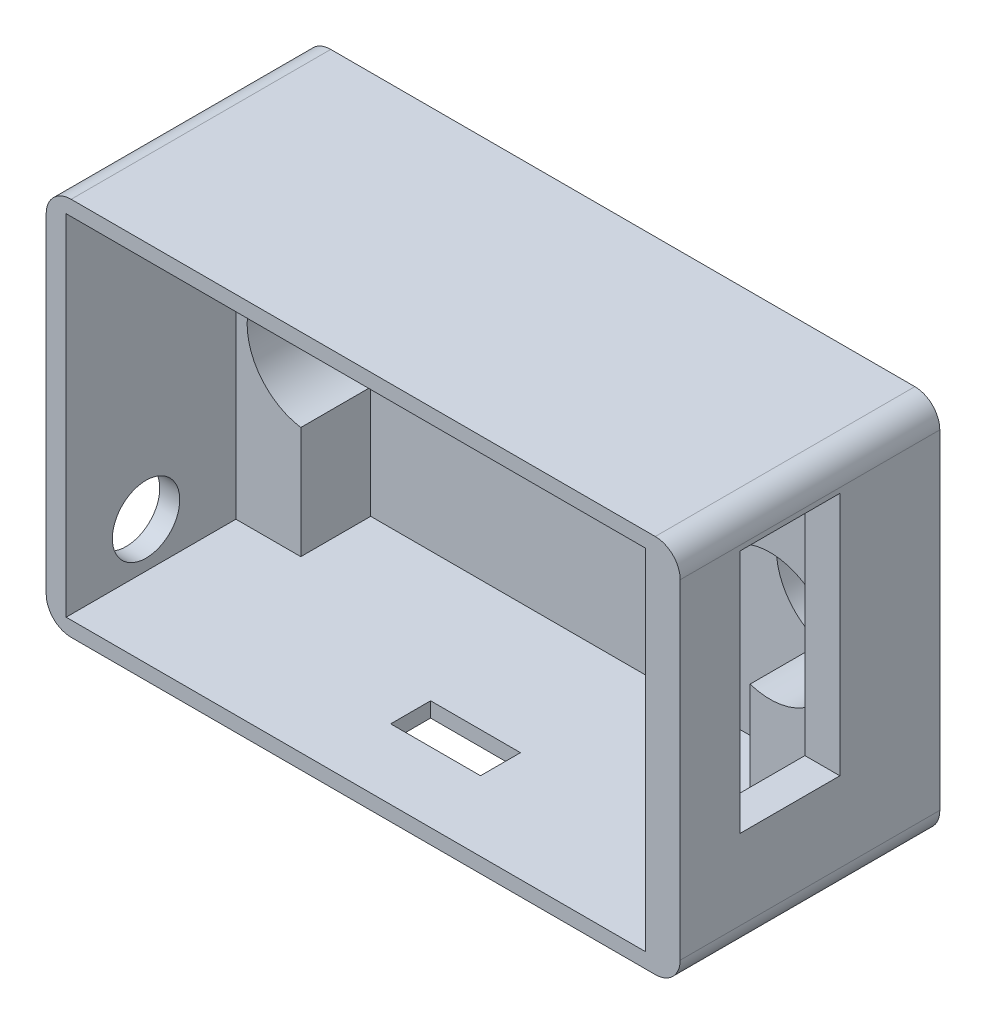
ISO-10303-21;
HEADER;
FILE_DESCRIPTION(('STEP AP214'),'2;1');
FILE_NAME('part.step','',(''),(''),'','','');
FILE_SCHEMA(('AUTOMOTIVE_DESIGN { 1 0 10303 214 1 1 1 1 }'));
ENDSEC;
DATA;
#1=APPLICATION_CONTEXT('core data for automotive mechanical design processes');
#2=APPLICATION_PROTOCOL_DEFINITION('international standard','automotive_design',2000,#1);
#3=PRODUCT_CONTEXT('',#1,'mechanical');
#4=PRODUCT('Part','Part','',(#3));
#5=PRODUCT_RELATED_PRODUCT_CATEGORY('part','',(#4));
#6=PRODUCT_DEFINITION_FORMATION('','',#4);
#7=PRODUCT_DEFINITION_CONTEXT('part definition',#1,'design');
#8=PRODUCT_DEFINITION('design','',#6,#7);
#9=PRODUCT_DEFINITION_SHAPE('','',#8);
#10=(LENGTH_UNIT() NAMED_UNIT(*) SI_UNIT(.MILLI.,.METRE.));
#11=(NAMED_UNIT(*) PLANE_ANGLE_UNIT() SI_UNIT($,.RADIAN.));
#12=(NAMED_UNIT(*) SI_UNIT($,.STERADIAN.) SOLID_ANGLE_UNIT());
#13=UNCERTAINTY_MEASURE_WITH_UNIT(LENGTH_MEASURE(1.E-05),#10,'distance_accuracy_value','');
#14=(GEOMETRIC_REPRESENTATION_CONTEXT(3) GLOBAL_UNCERTAINTY_ASSIGNED_CONTEXT((#13)) GLOBAL_UNIT_ASSIGNED_CONTEXT((#10,
#11,#12)) REPRESENTATION_CONTEXT('',''));
#15=CARTESIAN_POINT('',(0.,0.,0.));
#16=DIRECTION('',(0.,0.,1.));
#17=DIRECTION('',(1.,0.,0.));
#18=AXIS2_PLACEMENT_3D('',#15,#16,#17);
#19=CARTESIAN_POINT('',(0.,0.,9.));
#20=DIRECTION('',(0.,0.,1.));
#21=DIRECTION('',(1.,0.,0.));
#22=AXIS2_PLACEMENT_3D('',#19,#20,#21);
#23=PLANE('',#22);
#24=CARTESIAN_POINT('',(55.5,19.,9.));
#25=DIRECTION('',(0.,0.,-1.));
#26=DIRECTION('',(-1.,0.,0.));
#27=AXIS2_PLACEMENT_3D('',#24,#25,#26);
#28=CIRCLE('',#27,6.375);
#29=CARTESIAN_POINT('',(53.5,25.0531500064016,9.));
#30=VERTEX_POINT('',#29);
#31=CARTESIAN_POINT('',(60.,23.5155979670471,9.));
#32=VERTEX_POINT('',#31);
#33=EDGE_CURVE('E307',#30,#32,#28,.T.);
#34=ORIENTED_EDGE('',*,*,#33,.T.);
#35=DIRECTION('',(0.,1.,0.));
#36=VECTOR('',#35,1.);
#37=CARTESIAN_POINT('',(60.,36.5,9.));
#38=LINE('',#37,#36);
#39=CARTESIAN_POINT('',(60.,36.5,9.));
#40=VERTEX_POINT('',#39);
#41=EDGE_CURVE('E396',#32,#40,#38,.T.);
#42=ORIENTED_EDGE('',*,*,#41,.T.);
#43=DIRECTION('',(-1.,0.,0.));
#44=VECTOR('',#43,1.);
#45=CARTESIAN_POINT('',(2.,36.5,9.));
#46=LINE('',#45,#44);
#47=CARTESIAN_POINT('',(53.5,36.5,9.));
#48=VERTEX_POINT('',#47);
#49=EDGE_CURVE('E402',#40,#48,#46,.T.);
#50=ORIENTED_EDGE('',*,*,#49,.T.);
#51=DIRECTION('',(0.,1.,0.));
#52=VECTOR('',#51,1.);
#53=CARTESIAN_POINT('',(53.5,36.5,9.));
#54=LINE('',#53,#52);
#55=EDGE_CURVE('E367',#30,#48,#54,.T.);
#56=ORIENTED_EDGE('',*,*,#55,.F.);
#57=EDGE_LOOP('',(#34,#42,#50,#56));
#58=FACE_BOUND('',#57,.T.);
#59=ADVANCED_FACE('F39',(#58),#23,.T.);
#60=CARTESIAN_POINT('',(8.5,36.5,2.));
#61=DIRECTION('',(-1.,0.,0.));
#62=DIRECTION('',(0.,-1.,0.));
#63=AXIS2_PLACEMENT_3D('',#60,#61,#62);
#64=PLANE('',#63);
#65=DIRECTION('',(0.,-1.,0.));
#66=VECTOR('',#65,1.);
#67=CARTESIAN_POINT('',(8.5,36.5,9.));
#68=LINE('',#67,#66);
#69=CARTESIAN_POINT('',(8.5,36.5,9.));
#70=VERTEX_POINT('',#69);
#71=CARTESIAN_POINT('',(8.5,25.2960801297315,9.));
#72=VERTEX_POINT('',#71);
#73=EDGE_CURVE('E363',#70,#72,#68,.T.);
#74=ORIENTED_EDGE('',*,*,#73,.T.);
#75=DIRECTION('',(0.,0.,-1.));
#76=VECTOR('',#75,1.);
#77=CARTESIAN_POINT('',(8.5,25.2960801297315,9.));
#78=LINE('',#77,#76);
#79=CARTESIAN_POINT('',(8.5,25.2960801297315,2.));
#80=VERTEX_POINT('',#79);
#81=EDGE_CURVE('E328',#72,#80,#78,.T.);
#82=ORIENTED_EDGE('',*,*,#81,.T.);
#83=DIRECTION('',(0.,-1.,0.));
#84=VECTOR('',#83,1.);
#85=CARTESIAN_POINT('',(8.5,36.5,2.));
#86=LINE('',#85,#84);
#87=CARTESIAN_POINT('',(8.5,36.5,2.));
#88=VERTEX_POINT('',#87);
#89=EDGE_CURVE('E344',#88,#80,#86,.T.);
#90=ORIENTED_EDGE('',*,*,#89,.F.);
#91=DIRECTION('',(0.,0.,1.));
#92=VECTOR('',#91,1.);
#93=CARTESIAN_POINT('',(8.5,36.5,2.));
#94=LINE('',#93,#92);
#95=EDGE_CURVE('E372',#88,#70,#94,.T.);
#96=ORIENTED_EDGE('',*,*,#95,.T.);
#97=EDGE_LOOP('',(#74,#82,#90,#96));
#98=FACE_BOUND('',#97,.T.);
#99=ADVANCED_FACE('F581',(#98),#64,.F.);
#100=CARTESIAN_POINT('',(53.5,36.5,2.));
#101=DIRECTION('',(1.,0.,0.));
#102=DIRECTION('',(0.,1.,0.));
#103=AXIS2_PLACEMENT_3D('',#100,#101,#102);
#104=PLANE('',#103);
#105=CARTESIAN_POINT('',(53.5,1.49999999999999,9.));
#106=VERTEX_POINT('',#105);
#107=CARTESIAN_POINT('',(53.5,12.9468499935984,9.));
#108=VERTEX_POINT('',#107);
#109=EDGE_CURVE('E368',#106,#108,#54,.T.);
#110=ORIENTED_EDGE('',*,*,#109,.T.);
#111=DIRECTION('',(0.,0.,-1.));
#112=VECTOR('',#111,1.);
#113=CARTESIAN_POINT('',(53.5,12.9468499935984,9.));
#114=LINE('',#113,#112);
#115=CARTESIAN_POINT('',(53.5,12.9468499935984,2.));
#116=VERTEX_POINT('',#115);
#117=EDGE_CURVE('E336',#108,#116,#114,.T.);
#118=ORIENTED_EDGE('',*,*,#117,.T.);
#119=DIRECTION('',(0.,1.,0.));
#120=VECTOR('',#119,1.);
#121=CARTESIAN_POINT('',(53.5,36.5,2.));
#122=LINE('',#121,#120);
#123=CARTESIAN_POINT('',(53.5,1.49999999999999,2.));
#124=VERTEX_POINT('',#123);
#125=EDGE_CURVE('E354',#124,#116,#122,.T.);
#126=ORIENTED_EDGE('',*,*,#125,.F.);
#127=DIRECTION('',(0.,0.,1.));
#128=VECTOR('',#127,1.);
#129=CARTESIAN_POINT('',(53.5,1.49999999999999,2.));
#130=LINE('',#129,#128);
#131=EDGE_CURVE('E380',#124,#106,#130,.T.);
#132=ORIENTED_EDGE('',*,*,#131,.T.);
#133=EDGE_LOOP('',(#110,#118,#126,#132));
#134=FACE_BOUND('',#133,.T.);
#135=ADVANCED_FACE('F589',(#134),#104,.F.);
#136=CARTESIAN_POINT('',(9.5,19.,9.));
#137=DIRECTION('',(0.,0.,-1.));
#138=DIRECTION('',(-1.,0.,0.));
#139=AXIS2_PLACEMENT_3D('',#136,#137,#138);
#140=CIRCLE('',#139,6.375);
#141=CARTESIAN_POINT('',(8.5,12.7039198702685,9.));
#142=VERTEX_POINT('',#141);
#143=EDGE_CURVE('E318',#142,#72,#140,.T.);
#144=ORIENTED_EDGE('',*,*,#143,.T.);
#145=ORIENTED_EDGE('',*,*,#73,.F.);
#146=CARTESIAN_POINT('',(2.,36.5,9.));
#147=VERTEX_POINT('',#146);
#148=EDGE_CURVE('E401',#70,#147,#46,.T.);
#149=ORIENTED_EDGE('',*,*,#148,.T.);
#150=DIRECTION('',(0.,-1.,0.));
#151=VECTOR('',#150,1.);
#152=CARTESIAN_POINT('',(2.,36.5,9.));
#153=LINE('',#152,#151);
#154=CARTESIAN_POINT('',(2.,1.49999999999999,9.));
#155=VERTEX_POINT('',#154);
#156=EDGE_CURVE('E386',#147,#155,#153,.T.);
#157=ORIENTED_EDGE('',*,*,#156,.T.);
#158=DIRECTION('',(1.,0.,0.));
#159=VECTOR('',#158,1.);
#160=CARTESIAN_POINT('',(2.,1.49999999999999,9.));
#161=LINE('',#160,#159);
#162=CARTESIAN_POINT('',(8.5,1.49999999999999,9.));
#163=VERTEX_POINT('',#162);
#164=EDGE_CURVE('E392',#155,#163,#161,.T.);
#165=ORIENTED_EDGE('',*,*,#164,.T.);
#166=EDGE_CURVE('E343',#142,#163,#68,.T.);
#167=ORIENTED_EDGE('',*,*,#166,.F.);
#168=EDGE_LOOP('',(#144,#145,#149,#157,#165,#167));
#169=FACE_BOUND('',#168,.T.);
#170=ADVANCED_FACE('F584',(#169),#23,.T.);
#171=CARTESIAN_POINT('',(0.,0.,26.));
#172=DIRECTION('',(1.,0.,0.));
#173=DIRECTION('',(0.,0.,-1.));
#174=AXIS2_PLACEMENT_3D('',#171,#172,#173);
#175=PLANE('',#174);
#176=CARTESIAN_POINT('',(0.,6.,18.));
#177=DIRECTION('',(-1.,0.,0.));
#178=DIRECTION('',(0.,0.,1.));
#179=AXIS2_PLACEMENT_3D('',#176,#177,#178);
#180=CIRCLE('',#179,3.375);
#181=CARTESIAN_POINT('',(0.,6.,21.375));
#182=VERTEX_POINT('',#181);
#183=EDGE_CURVE('E269',#182,#182,#180,.T.);
#184=ORIENTED_EDGE('',*,*,#183,.F.);
#185=EDGE_LOOP('',(#184));
#186=FACE_BOUND('',#185,.T.);
#187=DIRECTION('',(0.,-1.,0.));
#188=VECTOR('',#187,1.);
#189=CARTESIAN_POINT('',(0.,0.,0.));
#190=LINE('',#189,#188);
#191=CARTESIAN_POINT('',(0.,35.5,0.));
#192=VERTEX_POINT('',#191);
#193=CARTESIAN_POINT('',(0.,2.5,0.));
#194=VERTEX_POINT('',#193);
#195=EDGE_CURVE('E423',#192,#194,#190,.T.);
#196=ORIENTED_EDGE('',*,*,#195,.T.);
#197=DIRECTION('',(0.,0.,-1.));
#198=VECTOR('',#197,1.);
#199=CARTESIAN_POINT('',(0.,2.5,26.));
#200=LINE('',#199,#198);
#201=CARTESIAN_POINT('',(0.,2.5,26.));
#202=VERTEX_POINT('',#201);
#203=EDGE_CURVE('E11',#194,#202,#200,.F.);
#204=ORIENTED_EDGE('',*,*,#203,.T.);
#205=DIRECTION('',(0.,-1.,0.));
#206=VECTOR('',#205,1.);
#207=CARTESIAN_POINT('',(0.,0.,26.));
#208=LINE('',#207,#206);
#209=CARTESIAN_POINT('',(0.,35.5,26.));
#210=VERTEX_POINT('',#209);
#211=EDGE_CURVE('E433',#210,#202,#208,.T.);
#212=ORIENTED_EDGE('',*,*,#211,.F.);
#213=DIRECTION('',(0.,0.,-1.));
#214=VECTOR('',#213,1.);
#215=CARTESIAN_POINT('',(0.,35.5,26.));
#216=LINE('',#215,#214);
#217=EDGE_CURVE('E48',#210,#192,#216,.T.);
#218=ORIENTED_EDGE('',*,*,#217,.T.);
#219=EDGE_LOOP('',(#196,#204,#212,#218));
#220=FACE_BOUND('',#219,.T.);
#221=ADVANCED_FACE('F547',(#186,#220),#175,.F.);
#222=CARTESIAN_POINT('',(0.,0.,26.));
#223=DIRECTION('',(0.,1.,0.));
#224=DIRECTION('',(0.,0.,1.));
#225=AXIS2_PLACEMENT_3D('',#222,#223,#224);
#226=PLANE('',#225);
#227=DIRECTION('',(1.,0.,0.));
#228=VECTOR('',#227,1.);
#229=CARTESIAN_POINT('',(27.5,0.,15.));
#230=LINE('',#229,#228);
#231=CARTESIAN_POINT('',(27.5,0.,15.));
#232=VERTEX_POINT('',#231);
#233=CARTESIAN_POINT('',(36.5,0.,15.));
#234=VERTEX_POINT('',#233);
#235=EDGE_CURVE('E249',#232,#234,#230,.T.);
#236=ORIENTED_EDGE('',*,*,#235,.F.);
#237=DIRECTION('',(0.,0.,-1.));
#238=VECTOR('',#237,1.);
#239=CARTESIAN_POINT('',(27.5,0.,19.));
#240=LINE('',#239,#238);
#241=CARTESIAN_POINT('',(27.5,0.,19.));
#242=VERTEX_POINT('',#241);
#243=EDGE_CURVE('E255',#242,#232,#240,.T.);
#244=ORIENTED_EDGE('',*,*,#243,.F.);
#245=DIRECTION('',(-1.,0.,0.));
#246=VECTOR('',#245,1.);
#247=CARTESIAN_POINT('',(27.5,0.,19.));
#248=LINE('',#247,#246);
#249=CARTESIAN_POINT('',(36.5,0.,19.));
#250=VERTEX_POINT('',#249);
#251=EDGE_CURVE('E259',#250,#242,#248,.T.);
#252=ORIENTED_EDGE('',*,*,#251,.F.);
#253=DIRECTION('',(0.,0.,1.));
#254=VECTOR('',#253,1.);
#255=CARTESIAN_POINT('',(36.5,0.,19.));
#256=LINE('',#255,#254);
#257=EDGE_CURVE('E237',#234,#250,#256,.T.);
#258=ORIENTED_EDGE('',*,*,#257,.F.);
#259=EDGE_LOOP('',(#236,#244,#252,#258));
#260=FACE_BOUND('',#259,.T.);
#261=DIRECTION('',(1.,0.,0.));
#262=VECTOR('',#261,1.);
#263=CARTESIAN_POINT('',(0.,0.,0.));
#264=LINE('',#263,#262);
#265=CARTESIAN_POINT('',(2.5,0.,0.));
#266=VERTEX_POINT('',#265);
#267=CARTESIAN_POINT('',(61.,0.,0.));
#268=VERTEX_POINT('',#267);
#269=EDGE_CURVE('E452',#266,#268,#264,.T.);
#270=ORIENTED_EDGE('',*,*,#269,.T.);
#271=DIRECTION('',(0.,0.,-1.));
#272=VECTOR('',#271,1.);
#273=CARTESIAN_POINT('',(61.,0.,26.));
#274=LINE('',#273,#272);
#275=CARTESIAN_POINT('',(61.,0.,26.));
#276=VERTEX_POINT('',#275);
#277=EDGE_CURVE('E55',#268,#276,#274,.F.);
#278=ORIENTED_EDGE('',*,*,#277,.T.);
#279=DIRECTION('',(1.,0.,0.));
#280=VECTOR('',#279,1.);
#281=CARTESIAN_POINT('',(0.,0.,26.));
#282=LINE('',#281,#280);
#283=CARTESIAN_POINT('',(2.5,0.,26.));
#284=VERTEX_POINT('',#283);
#285=EDGE_CURVE('E436',#284,#276,#282,.T.);
#286=ORIENTED_EDGE('',*,*,#285,.F.);
#287=DIRECTION('',(0.,0.,-1.));
#288=VECTOR('',#287,1.);
#289=CARTESIAN_POINT('',(2.5,0.,26.));
#290=LINE('',#289,#288);
#291=EDGE_CURVE('E536',#284,#266,#290,.T.);
#292=ORIENTED_EDGE('',*,*,#291,.T.);
#293=EDGE_LOOP('',(#270,#278,#286,#292));
#294=FACE_BOUND('',#293,.T.);
#295=ADVANCED_FACE('F257',(#260,#294),#226,.F.);
#296=CARTESIAN_POINT('',(63.5,0.,26.));
#297=DIRECTION('',(-1.,0.,0.));
#298=DIRECTION('',(0.,0.,1.));
#299=AXIS2_PLACEMENT_3D('',#296,#297,#298);
#300=PLANE('',#299);
#301=DIRECTION('',(0.,0.,-1.));
#302=VECTOR('',#301,1.);
#303=CARTESIAN_POINT('',(63.5,10.5,20.));
#304=LINE('',#303,#302);
#305=CARTESIAN_POINT('',(63.5,10.5,20.));
#306=VERTEX_POINT('',#305);
#307=CARTESIAN_POINT('',(63.5,10.5,10.0106629717915));
#308=VERTEX_POINT('',#307);
#309=EDGE_CURVE('E281',#306,#308,#304,.T.);
#310=ORIENTED_EDGE('',*,*,#309,.F.);
#311=DIRECTION('',(0.,-1.,0.));
#312=VECTOR('',#311,1.);
#313=CARTESIAN_POINT('',(63.5,35.,20.));
#314=LINE('',#313,#312);
#315=CARTESIAN_POINT('',(63.5,35.,20.));
#316=VERTEX_POINT('',#315);
#317=EDGE_CURVE('E278',#316,#306,#314,.T.);
#318=ORIENTED_EDGE('',*,*,#317,.F.);
#319=DIRECTION('',(0.,0.,1.));
#320=VECTOR('',#319,1.);
#321=CARTESIAN_POINT('',(63.5,35.,20.));
#322=LINE('',#321,#320);
#323=CARTESIAN_POINT('',(63.5,35.,10.0106629717915));
#324=VERTEX_POINT('',#323);
#325=EDGE_CURVE('E289',#324,#316,#322,.T.);
#326=ORIENTED_EDGE('',*,*,#325,.F.);
#327=DIRECTION('',(0.,1.,0.));
#328=VECTOR('',#327,1.);
#329=CARTESIAN_POINT('',(63.5,35.,10.0106629717915));
#330=LINE('',#329,#328);
#331=EDGE_CURVE('E285',#308,#324,#330,.T.);
#332=ORIENTED_EDGE('',*,*,#331,.F.);
#333=EDGE_LOOP('',(#310,#318,#326,#332));
#334=FACE_BOUND('',#333,.T.);
#335=DIRECTION('',(0.,1.,0.));
#336=VECTOR('',#335,1.);
#337=CARTESIAN_POINT('',(63.5,0.,0.));
#338=LINE('',#337,#336);
#339=CARTESIAN_POINT('',(63.5,2.5,0.));
#340=VERTEX_POINT('',#339);
#341=CARTESIAN_POINT('',(63.5,35.5,0.));
#342=VERTEX_POINT('',#341);
#343=EDGE_CURVE('E455',#340,#342,#338,.T.);
#344=ORIENTED_EDGE('',*,*,#343,.T.);
#345=DIRECTION('',(0.,0.,-1.));
#346=VECTOR('',#345,1.);
#347=CARTESIAN_POINT('',(63.5,35.5,26.));
#348=LINE('',#347,#346);
#349=CARTESIAN_POINT('',(63.5,35.5,26.));
#350=VERTEX_POINT('',#349);
#351=EDGE_CURVE('E522',#342,#350,#348,.F.);
#352=ORIENTED_EDGE('',*,*,#351,.T.);
#353=DIRECTION('',(0.,1.,0.));
#354=VECTOR('',#353,1.);
#355=CARTESIAN_POINT('',(63.5,0.,26.));
#356=LINE('',#355,#354);
#357=CARTESIAN_POINT('',(63.5,2.5,26.));
#358=VERTEX_POINT('',#357);
#359=EDGE_CURVE('E440',#358,#350,#356,.T.);
#360=ORIENTED_EDGE('',*,*,#359,.F.);
#361=DIRECTION('',(0.,0.,-1.));
#362=VECTOR('',#361,1.);
#363=CARTESIAN_POINT('',(63.5,2.5,26.));
#364=LINE('',#363,#362);
#365=EDGE_CURVE('E518',#358,#340,#364,.T.);
#366=ORIENTED_EDGE('',*,*,#365,.T.);
#367=EDGE_LOOP('',(#344,#352,#360,#366));
#368=FACE_BOUND('',#367,.T.);
#369=ADVANCED_FACE('F566',(#334,#368),#300,.F.);
#370=CARTESIAN_POINT('',(0.,38.,26.));
#371=DIRECTION('',(0.,-1.,0.));
#372=DIRECTION('',(0.,0.,-1.));
#373=AXIS2_PLACEMENT_3D('',#370,#371,#372);
#374=PLANE('',#373);
#375=DIRECTION('',(-1.,0.,0.));
#376=VECTOR('',#375,1.);
#377=CARTESIAN_POINT('',(0.,38.,26.));
#378=LINE('',#377,#376);
#379=CARTESIAN_POINT('',(61.,38.,26.));
#380=VERTEX_POINT('',#379);
#381=CARTESIAN_POINT('',(2.5,38.,26.));
#382=VERTEX_POINT('',#381);
#383=EDGE_CURVE('E444',#380,#382,#378,.T.);
#384=ORIENTED_EDGE('',*,*,#383,.F.);
#385=DIRECTION('',(0.,0.,-1.));
#386=VECTOR('',#385,1.);
#387=CARTESIAN_POINT('',(61.,38.,26.));
#388=LINE('',#387,#386);
#389=CARTESIAN_POINT('',(61.,38.,0.));
#390=VERTEX_POINT('',#389);
#391=EDGE_CURVE('E502',#380,#390,#388,.T.);
#392=ORIENTED_EDGE('',*,*,#391,.T.);
#393=DIRECTION('',(-1.,0.,0.));
#394=VECTOR('',#393,1.);
#395=CARTESIAN_POINT('',(0.,38.,0.));
#396=LINE('',#395,#394);
#397=CARTESIAN_POINT('',(2.5,38.,0.));
#398=VERTEX_POINT('',#397);
#399=EDGE_CURVE('E437',#390,#398,#396,.T.);
#400=ORIENTED_EDGE('',*,*,#399,.T.);
#401=DIRECTION('',(0.,0.,-1.));
#402=VECTOR('',#401,1.);
#403=CARTESIAN_POINT('',(2.5,38.,26.));
#404=LINE('',#403,#402);
#405=EDGE_CURVE('E499',#398,#382,#404,.F.);
#406=ORIENTED_EDGE('',*,*,#405,.T.);
#407=EDGE_LOOP('',(#384,#392,#400,#406));
#408=FACE_BOUND('',#407,.T.);
#409=ADVANCED_FACE('F574',(#408),#374,.F.);
#410=CARTESIAN_POINT('',(0.,0.,26.));
#411=DIRECTION('',(0.,0.,-1.));
#412=DIRECTION('',(-1.,0.,0.));
#413=AXIS2_PLACEMENT_3D('',#410,#411,#412);
#414=PLANE('',#413);
#415=DIRECTION('',(1.,0.,0.));
#416=VECTOR('',#415,1.);
#417=CARTESIAN_POINT('',(2.,1.49999999999999,26.));
#418=LINE('',#417,#416);
#419=CARTESIAN_POINT('',(2.,1.49999999999999,26.));
#420=VERTEX_POINT('',#419);
#421=CARTESIAN_POINT('',(60.,1.49999999999999,26.));
#422=VERTEX_POINT('',#421);
#423=EDGE_CURVE('E409',#420,#422,#418,.T.);
#424=ORIENTED_EDGE('',*,*,#423,.F.);
#425=DIRECTION('',(0.,-1.,0.));
#426=VECTOR('',#425,1.);
#427=CARTESIAN_POINT('',(2.,36.5,26.));
#428=LINE('',#427,#426);
#429=CARTESIAN_POINT('',(2.,36.5,26.));
#430=VERTEX_POINT('',#429);
#431=EDGE_CURVE('E375',#430,#420,#428,.T.);
#432=ORIENTED_EDGE('',*,*,#431,.F.);
#433=DIRECTION('',(-1.,0.,0.));
#434=VECTOR('',#433,1.);
#435=CARTESIAN_POINT('',(2.,36.5,26.));
#436=LINE('',#435,#434);
#437=CARTESIAN_POINT('',(60.,36.5,26.));
#438=VERTEX_POINT('',#437);
#439=EDGE_CURVE('E391',#438,#430,#436,.T.);
#440=ORIENTED_EDGE('',*,*,#439,.F.);
#441=DIRECTION('',(0.,1.,0.));
#442=VECTOR('',#441,1.);
#443=CARTESIAN_POINT('',(60.,36.5,26.));
#444=LINE('',#443,#442);
#445=EDGE_CURVE('E413',#422,#438,#444,.T.);
#446=ORIENTED_EDGE('',*,*,#445,.F.);
#447=EDGE_LOOP('',(#424,#432,#440,#446));
#448=FACE_BOUND('',#447,.T.);
#449=ORIENTED_EDGE('',*,*,#359,.T.);
#450=CARTESIAN_POINT('',(61.,35.5,26.));
#451=DIRECTION('',(0.,0.,-1.));
#452=DIRECTION('',(-1.,0.,0.));
#453=AXIS2_PLACEMENT_3D('',#450,#451,#452);
#454=CIRCLE('',#453,2.5);
#455=EDGE_CURVE('E533',#350,#380,#454,.F.);
#456=ORIENTED_EDGE('',*,*,#455,.T.);
#457=ORIENTED_EDGE('',*,*,#383,.T.);
#458=CARTESIAN_POINT('',(2.5,35.5,26.));
#459=DIRECTION('',(0.,0.,-1.));
#460=DIRECTION('',(-1.,0.,0.));
#461=AXIS2_PLACEMENT_3D('',#458,#459,#460);
#462=CIRCLE('',#461,2.5);
#463=EDGE_CURVE('E525',#382,#210,#462,.F.);
#464=ORIENTED_EDGE('',*,*,#463,.T.);
#465=ORIENTED_EDGE('',*,*,#211,.T.);
#466=CARTESIAN_POINT('',(2.5,2.5,26.));
#467=DIRECTION('',(0.,0.,-1.));
#468=DIRECTION('',(-1.,0.,0.));
#469=AXIS2_PLACEMENT_3D('',#466,#467,#468);
#470=CIRCLE('',#469,2.5);
#471=EDGE_CURVE('E62',#202,#284,#470,.F.);
#472=ORIENTED_EDGE('',*,*,#471,.T.);
#473=ORIENTED_EDGE('',*,*,#285,.T.);
#474=CARTESIAN_POINT('',(61.,2.5,26.));
#475=DIRECTION('',(0.,0.,-1.));
#476=DIRECTION('',(-1.,0.,0.));
#477=AXIS2_PLACEMENT_3D('',#474,#475,#476);
#478=CIRCLE('',#477,2.5);
#479=EDGE_CURVE('E530',#276,#358,#478,.F.);
#480=ORIENTED_EDGE('',*,*,#479,.T.);
#481=EDGE_LOOP('',(#449,#456,#457,#464,#465,#472,#473,#480));
#482=FACE_BOUND('',#481,.T.);
#483=ADVANCED_FACE('F559',(#448,#482),#414,.F.);
#484=CARTESIAN_POINT('',(0.,0.,0.));
#485=DIRECTION('',(0.,0.,-1.));
#486=DIRECTION('',(-1.,0.,0.));
#487=AXIS2_PLACEMENT_3D('',#484,#485,#486);
#488=PLANE('',#487);
#489=CARTESIAN_POINT('',(55.5,19.,0.));
#490=DIRECTION('',(0.,0.,-1.));
#491=DIRECTION('',(-1.,0.,0.));
#492=AXIS2_PLACEMENT_3D('',#489,#490,#491);
#493=CIRCLE('',#492,6.375);
#494=CARTESIAN_POINT('',(49.125,19.,0.));
#495=VERTEX_POINT('',#494);
#496=EDGE_CURVE('E314',#495,#495,#493,.T.);
#497=ORIENTED_EDGE('',*,*,#496,.F.);
#498=EDGE_LOOP('',(#497));
#499=FACE_BOUND('',#498,.T.);
#500=CARTESIAN_POINT('',(9.5,19.,0.));
#501=DIRECTION('',(0.,0.,-1.));
#502=DIRECTION('',(-1.,0.,0.));
#503=AXIS2_PLACEMENT_3D('',#500,#501,#502);
#504=CIRCLE('',#503,6.375);
#505=CARTESIAN_POINT('',(3.125,19.,0.));
#506=VERTEX_POINT('',#505);
#507=EDGE_CURVE('E297',#506,#506,#504,.T.);
#508=ORIENTED_EDGE('',*,*,#507,.F.);
#509=EDGE_LOOP('',(#508));
#510=FACE_BOUND('',#509,.T.);
#511=ORIENTED_EDGE('',*,*,#399,.F.);
#512=CARTESIAN_POINT('',(61.,35.5,0.));
#513=DIRECTION('',(0.,0.,-1.));
#514=DIRECTION('',(-1.,0.,0.));
#515=AXIS2_PLACEMENT_3D('',#512,#513,#514);
#516=CIRCLE('',#515,2.5);
#517=EDGE_CURVE('E515',#390,#342,#516,.T.);
#518=ORIENTED_EDGE('',*,*,#517,.T.);
#519=ORIENTED_EDGE('',*,*,#343,.F.);
#520=CARTESIAN_POINT('',(61.,2.5,0.));
#521=DIRECTION('',(0.,0.,-1.));
#522=DIRECTION('',(-1.,0.,0.));
#523=AXIS2_PLACEMENT_3D('',#520,#521,#522);
#524=CIRCLE('',#523,2.5);
#525=EDGE_CURVE('E512',#340,#268,#524,.T.);
#526=ORIENTED_EDGE('',*,*,#525,.T.);
#527=ORIENTED_EDGE('',*,*,#269,.F.);
#528=CARTESIAN_POINT('',(2.5,2.5,0.));
#529=DIRECTION('',(0.,0.,-1.));
#530=DIRECTION('',(-1.,0.,0.));
#531=AXIS2_PLACEMENT_3D('',#528,#529,#530);
#532=CIRCLE('',#531,2.5);
#533=EDGE_CURVE('E509',#266,#194,#532,.T.);
#534=ORIENTED_EDGE('',*,*,#533,.T.);
#535=ORIENTED_EDGE('',*,*,#195,.F.);
#536=CARTESIAN_POINT('',(2.5,35.5,0.));
#537=DIRECTION('',(0.,0.,-1.));
#538=DIRECTION('',(-1.,0.,0.));
#539=AXIS2_PLACEMENT_3D('',#536,#537,#538);
#540=CIRCLE('',#539,2.5);
#541=EDGE_CURVE('E506',#192,#398,#540,.T.);
#542=ORIENTED_EDGE('',*,*,#541,.T.);
#543=EDGE_LOOP('',(#511,#518,#519,#526,#527,#534,#535,#542));
#544=FACE_BOUND('',#543,.T.);
#545=ADVANCED_FACE('F553',(#499,#510,#544),#488,.T.);
#546=CARTESIAN_POINT('',(2.,36.5,9.));
#547=DIRECTION('',(-1.,0.,0.));
#548=DIRECTION('',(0.,-1.,0.));
#549=AXIS2_PLACEMENT_3D('',#546,#547,#548);
#550=PLANE('',#549);
#551=CARTESIAN_POINT('',(2.,6.,18.));
#552=DIRECTION('',(-1.,0.,0.));
#553=DIRECTION('',(0.,-1.,0.));
#554=AXIS2_PLACEMENT_3D('',#551,#552,#553);
#555=CIRCLE('',#554,3.375);
#556=CARTESIAN_POINT('',(2.,2.625,18.));
#557=VERTEX_POINT('',#556);
#558=EDGE_CURVE('E277',#557,#557,#555,.T.);
#559=ORIENTED_EDGE('',*,*,#558,.T.);
#560=EDGE_LOOP('',(#559));
#561=FACE_BOUND('',#560,.T.);
#562=ORIENTED_EDGE('',*,*,#431,.T.);
#563=DIRECTION('',(0.,0.,1.));
#564=VECTOR('',#563,1.);
#565=CARTESIAN_POINT('',(2.,1.49999999999999,9.));
#566=LINE('',#565,#564);
#567=EDGE_CURVE('E406',#155,#420,#566,.T.);
#568=ORIENTED_EDGE('',*,*,#567,.F.);
#569=ORIENTED_EDGE('',*,*,#156,.F.);
#570=DIRECTION('',(0.,0.,1.));
#571=VECTOR('',#570,1.);
#572=CARTESIAN_POINT('',(2.,36.5,9.));
#573=LINE('',#572,#571);
#574=EDGE_CURVE('E420',#147,#430,#573,.T.);
#575=ORIENTED_EDGE('',*,*,#574,.T.);
#576=EDGE_LOOP('',(#562,#568,#569,#575));
#577=FACE_BOUND('',#576,.T.);
#578=ADVANCED_FACE('F645',(#561,#577),#550,.F.);
#579=CARTESIAN_POINT('',(2.,36.5,9.));
#580=DIRECTION('',(0.,1.,0.));
#581=DIRECTION('',(0.,0.,1.));
#582=AXIS2_PLACEMENT_3D('',#579,#580,#581);
#583=PLANE('',#582);
#584=ORIENTED_EDGE('',*,*,#439,.T.);
#585=ORIENTED_EDGE('',*,*,#574,.F.);
#586=ORIENTED_EDGE('',*,*,#148,.F.);
#587=ORIENTED_EDGE('',*,*,#95,.F.);
#588=DIRECTION('',(-1.,0.,0.));
#589=VECTOR('',#588,1.);
#590=CARTESIAN_POINT('',(8.5,36.5,2.));
#591=LINE('',#590,#589);
#592=CARTESIAN_POINT('',(53.5,36.5,2.));
#593=VERTEX_POINT('',#592);
#594=EDGE_CURVE('E358',#593,#88,#591,.T.);
#595=ORIENTED_EDGE('',*,*,#594,.F.);
#596=DIRECTION('',(0.,0.,1.));
#597=VECTOR('',#596,1.);
#598=CARTESIAN_POINT('',(53.5,36.5,2.));
#599=LINE('',#598,#597);
#600=EDGE_CURVE('E376',#593,#48,#599,.T.);
#601=ORIENTED_EDGE('',*,*,#600,.T.);
#602=ORIENTED_EDGE('',*,*,#49,.F.);
#603=DIRECTION('',(0.,0.,1.));
#604=VECTOR('',#603,1.);
#605=CARTESIAN_POINT('',(60.,36.5,9.));
#606=LINE('',#605,#604);
#607=EDGE_CURVE('E424',#40,#438,#606,.T.);
#608=ORIENTED_EDGE('',*,*,#607,.T.);
#609=EDGE_LOOP('',(#584,#585,#586,#587,#595,#601,#602,#608));
#610=FACE_BOUND('',#609,.T.);
#611=ADVANCED_FACE('F641',(#610),#583,.F.);
#612=CARTESIAN_POINT('',(60.,36.5,9.));
#613=DIRECTION('',(1.,0.,0.));
#614=DIRECTION('',(0.,1.,0.));
#615=AXIS2_PLACEMENT_3D('',#612,#613,#614);
#616=PLANE('',#615);
#617=DIRECTION('',(0.,0.,1.));
#618=VECTOR('',#617,1.);
#619=CARTESIAN_POINT('',(60.,35.,9.));
#620=LINE('',#619,#618);
#621=CARTESIAN_POINT('',(60.,35.,10.0106629717915));
#622=VERTEX_POINT('',#621);
#623=CARTESIAN_POINT('',(60.,35.,20.));
#624=VERTEX_POINT('',#623);
#625=EDGE_CURVE('E475',#622,#624,#620,.T.);
#626=ORIENTED_EDGE('',*,*,#625,.T.);
#627=DIRECTION('',(0.,-1.,0.));
#628=VECTOR('',#627,1.);
#629=CARTESIAN_POINT('',(60.,36.5,20.));
#630=LINE('',#629,#628);
#631=CARTESIAN_POINT('',(60.,10.5,20.));
#632=VERTEX_POINT('',#631);
#633=EDGE_CURVE('E479',#624,#632,#630,.T.);
#634=ORIENTED_EDGE('',*,*,#633,.T.);
#635=DIRECTION('',(0.,0.,-1.));
#636=VECTOR('',#635,1.);
#637=CARTESIAN_POINT('',(60.,10.5,9.));
#638=LINE('',#637,#636);
#639=CARTESIAN_POINT('',(60.,10.5,10.0106629717915));
#640=VERTEX_POINT('',#639);
#641=EDGE_CURVE('E467',#632,#640,#638,.T.);
#642=ORIENTED_EDGE('',*,*,#641,.T.);
#643=DIRECTION('',(0.,1.,0.));
#644=VECTOR('',#643,1.);
#645=CARTESIAN_POINT('',(60.,36.5,10.0106629717915));
#646=LINE('',#645,#644);
#647=EDGE_CURVE('E471',#640,#622,#646,.T.);
#648=ORIENTED_EDGE('',*,*,#647,.T.);
#649=EDGE_LOOP('',(#626,#634,#642,#648));
#650=FACE_BOUND('',#649,.T.);
#651=ORIENTED_EDGE('',*,*,#445,.T.);
#652=ORIENTED_EDGE('',*,*,#607,.F.);
#653=ORIENTED_EDGE('',*,*,#41,.F.);
#654=DIRECTION('',(0.,1.,0.));
#655=VECTOR('',#654,1.);
#656=CARTESIAN_POINT('',(60.,36.5,9.));
#657=LINE('',#656,#655);
#658=CARTESIAN_POINT('',(60.,14.4844020329529,9.));
#659=VERTEX_POINT('',#658);
#660=EDGE_CURVE('E340',#659,#32,#657,.T.);
#661=ORIENTED_EDGE('',*,*,#660,.F.);
#662=CARTESIAN_POINT('',(60.,1.49999999999999,9.));
#663=VERTEX_POINT('',#662);
#664=EDGE_CURVE('E397',#663,#659,#38,.T.);
#665=ORIENTED_EDGE('',*,*,#664,.F.);
#666=DIRECTION('',(0.,0.,1.));
#667=VECTOR('',#666,1.);
#668=CARTESIAN_POINT('',(60.,1.49999999999999,9.));
#669=LINE('',#668,#667);
#670=EDGE_CURVE('E427',#663,#422,#669,.T.);
#671=ORIENTED_EDGE('',*,*,#670,.T.);
#672=EDGE_LOOP('',(#651,#652,#653,#661,#665,#671));
#673=FACE_BOUND('',#672,.T.);
#674=ADVANCED_FACE('F605',(#650,#673),#616,.F.);
#675=CARTESIAN_POINT('',(2.,1.49999999999999,9.));
#676=DIRECTION('',(0.,-1.,0.));
#677=DIRECTION('',(1.,0.,0.));
#678=AXIS2_PLACEMENT_3D('',#675,#676,#677);
#679=PLANE('',#678);
#680=DIRECTION('',(-1.,0.,0.));
#681=VECTOR('',#680,1.);
#682=CARTESIAN_POINT('',(2.,1.49999999999999,19.));
#683=LINE('',#682,#681);
#684=CARTESIAN_POINT('',(36.5,1.49999999999999,19.));
#685=VERTEX_POINT('',#684);
#686=CARTESIAN_POINT('',(27.5,1.49999999999999,19.));
#687=VERTEX_POINT('',#686);
#688=EDGE_CURVE('E491',#685,#687,#683,.T.);
#689=ORIENTED_EDGE('',*,*,#688,.T.);
#690=DIRECTION('',(0.,0.,-1.));
#691=VECTOR('',#690,1.);
#692=CARTESIAN_POINT('',(27.5,1.49999999999999,9.));
#693=LINE('',#692,#691);
#694=CARTESIAN_POINT('',(27.5,1.49999999999999,15.));
#695=VERTEX_POINT('',#694);
#696=EDGE_CURVE('E495',#687,#695,#693,.T.);
#697=ORIENTED_EDGE('',*,*,#696,.T.);
#698=DIRECTION('',(1.,0.,0.));
#699=VECTOR('',#698,1.);
#700=CARTESIAN_POINT('',(2.,1.49999999999999,15.));
#701=LINE('',#700,#699);
#702=CARTESIAN_POINT('',(36.5,1.49999999999999,15.));
#703=VERTEX_POINT('',#702);
#704=EDGE_CURVE('E483',#695,#703,#701,.T.);
#705=ORIENTED_EDGE('',*,*,#704,.T.);
#706=DIRECTION('',(0.,0.,1.));
#707=VECTOR('',#706,1.);
#708=CARTESIAN_POINT('',(36.5,1.49999999999999,9.));
#709=LINE('',#708,#707);
#710=EDGE_CURVE('E240',#703,#685,#709,.T.);
#711=ORIENTED_EDGE('',*,*,#710,.T.);
#712=EDGE_LOOP('',(#689,#697,#705,#711));
#713=FACE_BOUND('',#712,.T.);
#714=ORIENTED_EDGE('',*,*,#423,.T.);
#715=ORIENTED_EDGE('',*,*,#670,.F.);
#716=EDGE_CURVE('E390',#106,#663,#161,.T.);
#717=ORIENTED_EDGE('',*,*,#716,.F.);
#718=ORIENTED_EDGE('',*,*,#131,.F.);
#719=DIRECTION('',(1.,0.,0.));
#720=VECTOR('',#719,1.);
#721=CARTESIAN_POINT('',(8.5,1.49999999999999,2.));
#722=LINE('',#721,#720);
#723=CARTESIAN_POINT('',(8.5,1.49999999999999,2.));
#724=VERTEX_POINT('',#723);
#725=EDGE_CURVE('E348',#724,#124,#722,.T.);
#726=ORIENTED_EDGE('',*,*,#725,.F.);
#727=DIRECTION('',(0.,0.,1.));
#728=VECTOR('',#727,1.);
#729=CARTESIAN_POINT('',(8.5,1.49999999999999,2.));
#730=LINE('',#729,#728);
#731=EDGE_CURVE('E362',#724,#163,#730,.T.);
#732=ORIENTED_EDGE('',*,*,#731,.T.);
#733=ORIENTED_EDGE('',*,*,#164,.F.);
#734=ORIENTED_EDGE('',*,*,#567,.T.);
#735=EDGE_LOOP('',(#714,#715,#717,#718,#726,#732,#733,#734));
#736=FACE_BOUND('',#735,.T.);
#737=ADVANCED_FACE('F597',(#713,#736),#679,.F.);
#738=EDGE_CURVE('E313',#659,#108,#28,.T.);
#739=ORIENTED_EDGE('',*,*,#738,.T.);
#740=ORIENTED_EDGE('',*,*,#109,.F.);
#741=ORIENTED_EDGE('',*,*,#716,.T.);
#742=ORIENTED_EDGE('',*,*,#664,.T.);
#743=EDGE_LOOP('',(#739,#740,#741,#742));
#744=FACE_BOUND('',#743,.T.);
#745=ADVANCED_FACE('F585',(#744),#23,.T.);
#746=CARTESIAN_POINT('',(8.5,12.7039198702685,2.));
#747=VERTEX_POINT('',#746);
#748=EDGE_CURVE('E349',#747,#724,#86,.T.);
#749=ORIENTED_EDGE('',*,*,#748,.F.);
#750=DIRECTION('',(0.,0.,-1.));
#751=VECTOR('',#750,1.);
#752=CARTESIAN_POINT('',(8.5,12.7039198702685,9.));
#753=LINE('',#752,#751);
#754=EDGE_CURVE('E311',#747,#142,#753,.F.);
#755=ORIENTED_EDGE('',*,*,#754,.T.);
#756=ORIENTED_EDGE('',*,*,#166,.T.);
#757=ORIENTED_EDGE('',*,*,#731,.F.);
#758=EDGE_LOOP('',(#749,#755,#756,#757));
#759=FACE_BOUND('',#758,.T.);
#760=ADVANCED_FACE('F592',(#759),#64,.F.);
#761=CARTESIAN_POINT('',(53.5,25.0531500064016,2.));
#762=VERTEX_POINT('',#761);
#763=EDGE_CURVE('E353',#762,#593,#122,.T.);
#764=ORIENTED_EDGE('',*,*,#763,.F.);
#765=DIRECTION('',(0.,0.,-1.));
#766=VECTOR('',#765,1.);
#767=CARTESIAN_POINT('',(53.5,25.0531500064016,9.));
#768=LINE('',#767,#766);
#769=EDGE_CURVE('E332',#762,#30,#768,.F.);
#770=ORIENTED_EDGE('',*,*,#769,.T.);
#771=ORIENTED_EDGE('',*,*,#55,.T.);
#772=ORIENTED_EDGE('',*,*,#600,.F.);
#773=EDGE_LOOP('',(#764,#770,#771,#772));
#774=FACE_BOUND('',#773,.T.);
#775=ADVANCED_FACE('F603',(#774),#104,.F.);
#776=CARTESIAN_POINT('',(0.,0.,2.));
#777=DIRECTION('',(0.,0.,1.));
#778=DIRECTION('',(1.,0.,0.));
#779=AXIS2_PLACEMENT_3D('',#776,#777,#778);
#780=PLANE('',#779);
#781=CARTESIAN_POINT('',(55.5,19.,2.));
#782=DIRECTION('',(0.,0.,1.));
#783=DIRECTION('',(1.,0.,0.));
#784=AXIS2_PLACEMENT_3D('',#781,#782,#783);
#785=CIRCLE('',#784,6.375);
#786=EDGE_CURVE('E464',#762,#116,#785,.T.);
#787=ORIENTED_EDGE('',*,*,#786,.F.);
#788=ORIENTED_EDGE('',*,*,#763,.T.);
#789=ORIENTED_EDGE('',*,*,#594,.T.);
#790=ORIENTED_EDGE('',*,*,#89,.T.);
#791=CARTESIAN_POINT('',(9.5,19.,2.));
#792=DIRECTION('',(0.,0.,1.));
#793=DIRECTION('',(1.,0.,0.));
#794=AXIS2_PLACEMENT_3D('',#791,#792,#793);
#795=CIRCLE('',#794,6.375);
#796=EDGE_CURVE('E448',#747,#80,#795,.T.);
#797=ORIENTED_EDGE('',*,*,#796,.F.);
#798=ORIENTED_EDGE('',*,*,#748,.T.);
#799=ORIENTED_EDGE('',*,*,#725,.T.);
#800=ORIENTED_EDGE('',*,*,#125,.T.);
#801=EDGE_LOOP('',(#787,#788,#789,#790,#797,#798,#799,#800));
#802=FACE_BOUND('',#801,.T.);
#803=ADVANCED_FACE('F656',(#802),#780,.T.);
#804=CARTESIAN_POINT('',(9.5,19.,9.));
#805=DIRECTION('',(0.,0.,-1.));
#806=DIRECTION('',(-1.,0.,0.));
#807=AXIS2_PLACEMENT_3D('',#804,#805,#806);
#808=CYLINDRICAL_SURFACE('',#807,6.375);
#809=ORIENTED_EDGE('',*,*,#507,.T.);
#810=EDGE_LOOP('',(#809));
#811=FACE_BOUND('',#810,.T.);
#812=ORIENTED_EDGE('',*,*,#143,.F.);
#813=ORIENTED_EDGE('',*,*,#754,.F.);
#814=ORIENTED_EDGE('',*,*,#796,.T.);
#815=ORIENTED_EDGE('',*,*,#81,.F.);
#816=EDGE_LOOP('',(#812,#813,#814,#815));
#817=FACE_BOUND('',#816,.T.);
#818=ADVANCED_FACE('F653',(#811,#817),#808,.F.);
#819=CARTESIAN_POINT('',(55.5,19.,9.));
#820=DIRECTION('',(0.,0.,-1.));
#821=DIRECTION('',(-1.,0.,0.));
#822=AXIS2_PLACEMENT_3D('',#819,#820,#821);
#823=PLANE('',#822);
#824=ORIENTED_EDGE('',*,*,#660,.T.);
#825=EDGE_CURVE('E312',#32,#659,#28,.T.);
#826=ORIENTED_EDGE('',*,*,#825,.T.);
#827=EDGE_LOOP('',(#824,#826));
#828=FACE_BOUND('',#827,.T.);
#829=ADVANCED_FACE('F630',(#828),#823,.T.);
#830=CARTESIAN_POINT('',(55.5,19.,9.));
#831=DIRECTION('',(0.,0.,-1.));
#832=DIRECTION('',(-1.,0.,0.));
#833=AXIS2_PLACEMENT_3D('',#830,#831,#832);
#834=CYLINDRICAL_SURFACE('',#833,6.375);
#835=ORIENTED_EDGE('',*,*,#496,.T.);
#836=EDGE_LOOP('',(#835));
#837=FACE_BOUND('',#836,.T.);
#838=ORIENTED_EDGE('',*,*,#738,.F.);
#839=ORIENTED_EDGE('',*,*,#825,.F.);
#840=ORIENTED_EDGE('',*,*,#33,.F.);
#841=ORIENTED_EDGE('',*,*,#769,.F.);
#842=ORIENTED_EDGE('',*,*,#786,.T.);
#843=ORIENTED_EDGE('',*,*,#117,.F.);
#844=EDGE_LOOP('',(#838,#839,#840,#841,#842,#843));
#845=FACE_BOUND('',#844,.T.);
#846=ADVANCED_FACE('F663',(#837,#845),#834,.F.);
#847=CARTESIAN_POINT('',(46.5,35.,20.));
#848=DIRECTION('',(0.,0.,1.));
#849=DIRECTION('',(0.,-1.,0.));
#850=AXIS2_PLACEMENT_3D('',#847,#848,#849);
#851=PLANE('',#850);
#852=DIRECTION('',(1.,0.,0.));
#853=VECTOR('',#852,1.);
#854=CARTESIAN_POINT('',(46.5,35.,20.));
#855=LINE('',#854,#853);
#856=EDGE_CURVE('E294',#624,#316,#855,.T.);
#857=ORIENTED_EDGE('',*,*,#856,.T.);
#858=ORIENTED_EDGE('',*,*,#317,.T.);
#859=DIRECTION('',(1.,0.,0.));
#860=VECTOR('',#859,1.);
#861=CARTESIAN_POINT('',(46.5,10.5,20.));
#862=LINE('',#861,#860);
#863=EDGE_CURVE('E293',#632,#306,#862,.T.);
#864=ORIENTED_EDGE('',*,*,#863,.F.);
#865=ORIENTED_EDGE('',*,*,#633,.F.);
#866=EDGE_LOOP('',(#857,#858,#864,#865));
#867=FACE_BOUND('',#866,.T.);
#868=ADVANCED_FACE('F665',(#867),#851,.F.);
#869=CARTESIAN_POINT('',(46.5,35.,20.));
#870=DIRECTION('',(0.,1.,0.));
#871=DIRECTION('',(0.,0.,1.));
#872=AXIS2_PLACEMENT_3D('',#869,#870,#871);
#873=PLANE('',#872);
#874=DIRECTION('',(1.,0.,0.));
#875=VECTOR('',#874,1.);
#876=CARTESIAN_POINT('',(46.5,35.,10.0106629717915));
#877=LINE('',#876,#875);
#878=EDGE_CURVE('E298',#622,#324,#877,.T.);
#879=ORIENTED_EDGE('',*,*,#878,.T.);
#880=ORIENTED_EDGE('',*,*,#325,.T.);
#881=ORIENTED_EDGE('',*,*,#856,.F.);
#882=ORIENTED_EDGE('',*,*,#625,.F.);
#883=EDGE_LOOP('',(#879,#880,#881,#882));
#884=FACE_BOUND('',#883,.T.);
#885=ADVANCED_FACE('F672',(#884),#873,.F.);
#886=CARTESIAN_POINT('',(46.5,35.,10.0106629717915));
#887=DIRECTION('',(0.,0.,-1.));
#888=DIRECTION('',(0.,1.,0.));
#889=AXIS2_PLACEMENT_3D('',#886,#887,#888);
#890=PLANE('',#889);
#891=DIRECTION('',(1.,0.,0.));
#892=VECTOR('',#891,1.);
#893=CARTESIAN_POINT('',(46.5,10.5,10.0106629717915));
#894=LINE('',#893,#892);
#895=EDGE_CURVE('E301',#640,#308,#894,.T.);
#896=ORIENTED_EDGE('',*,*,#895,.T.);
#897=ORIENTED_EDGE('',*,*,#331,.T.);
#898=ORIENTED_EDGE('',*,*,#878,.F.);
#899=ORIENTED_EDGE('',*,*,#647,.F.);
#900=EDGE_LOOP('',(#896,#897,#898,#899));
#901=FACE_BOUND('',#900,.T.);
#902=ADVANCED_FACE('F838',(#901),#890,.F.);
#903=CARTESIAN_POINT('',(46.5,10.5,20.));
#904=DIRECTION('',(0.,-1.,0.));
#905=DIRECTION('',(0.,0.,-1.));
#906=AXIS2_PLACEMENT_3D('',#903,#904,#905);
#907=PLANE('',#906);
#908=ORIENTED_EDGE('',*,*,#863,.T.);
#909=ORIENTED_EDGE('',*,*,#309,.T.);
#910=ORIENTED_EDGE('',*,*,#895,.F.);
#911=ORIENTED_EDGE('',*,*,#641,.F.);
#912=EDGE_LOOP('',(#908,#909,#910,#911));
#913=FACE_BOUND('',#912,.T.);
#914=ADVANCED_FACE('F834',(#913),#907,.F.);
#915=CARTESIAN_POINT('',(7.,6.,18.));
#916=DIRECTION('',(-1.,0.,0.));
#917=DIRECTION('',(0.,0.,1.));
#918=AXIS2_PLACEMENT_3D('',#915,#916,#917);
#919=CYLINDRICAL_SURFACE('',#918,3.375);
#920=ORIENTED_EDGE('',*,*,#183,.T.);
#921=EDGE_LOOP('',(#920));
#922=FACE_BOUND('',#921,.T.);
#923=ORIENTED_EDGE('',*,*,#558,.F.);
#924=EDGE_LOOP('',(#923));
#925=FACE_BOUND('',#924,.T.);
#926=ADVANCED_FACE('F769',(#922,#925),#919,.F.);
#927=CARTESIAN_POINT('',(27.5,7.,19.));
#928=DIRECTION('',(-1.,0.,0.));
#929=DIRECTION('',(0.,0.,1.));
#930=AXIS2_PLACEMENT_3D('',#927,#928,#929);
#931=PLANE('',#930);
#932=DIRECTION('',(0.,-1.,0.));
#933=VECTOR('',#932,1.);
#934=CARTESIAN_POINT('',(27.5,7.,19.));
#935=LINE('',#934,#933);
#936=EDGE_CURVE('E266',#687,#242,#935,.T.);
#937=ORIENTED_EDGE('',*,*,#936,.T.);
#938=ORIENTED_EDGE('',*,*,#243,.T.);
#939=DIRECTION('',(0.,-1.,0.));
#940=VECTOR('',#939,1.);
#941=CARTESIAN_POINT('',(27.5,7.,15.));
#942=LINE('',#941,#940);
#943=EDGE_CURVE('E245',#695,#232,#942,.T.);
#944=ORIENTED_EDGE('',*,*,#943,.F.);
#945=ORIENTED_EDGE('',*,*,#696,.F.);
#946=EDGE_LOOP('',(#937,#938,#944,#945));
#947=FACE_BOUND('',#946,.T.);
#948=ADVANCED_FACE('F773',(#947),#931,.F.);
#949=CARTESIAN_POINT('',(27.5,7.,19.));
#950=DIRECTION('',(0.,0.,1.));
#951=DIRECTION('',(1.,0.,0.));
#952=AXIS2_PLACEMENT_3D('',#949,#950,#951);
#953=PLANE('',#952);
#954=DIRECTION('',(0.,-1.,0.));
#955=VECTOR('',#954,1.);
#956=CARTESIAN_POINT('',(36.5,7.,19.));
#957=LINE('',#956,#955);
#958=EDGE_CURVE('E244',#685,#250,#957,.T.);
#959=ORIENTED_EDGE('',*,*,#958,.T.);
#960=ORIENTED_EDGE('',*,*,#251,.T.);
#961=ORIENTED_EDGE('',*,*,#936,.F.);
#962=ORIENTED_EDGE('',*,*,#688,.F.);
#963=EDGE_LOOP('',(#959,#960,#961,#962));
#964=FACE_BOUND('',#963,.T.);
#965=ADVANCED_FACE('F778',(#964),#953,.F.);
#966=CARTESIAN_POINT('',(36.5,7.,19.));
#967=DIRECTION('',(1.,0.,0.));
#968=DIRECTION('',(0.,0.,-1.));
#969=AXIS2_PLACEMENT_3D('',#966,#967,#968);
#970=PLANE('',#969);
#971=DIRECTION('',(0.,-1.,0.));
#972=VECTOR('',#971,1.);
#973=CARTESIAN_POINT('',(36.5,7.,15.));
#974=LINE('',#973,#972);
#975=EDGE_CURVE('E232',#703,#234,#974,.T.);
#976=ORIENTED_EDGE('',*,*,#975,.T.);
#977=ORIENTED_EDGE('',*,*,#257,.T.);
#978=ORIENTED_EDGE('',*,*,#958,.F.);
#979=ORIENTED_EDGE('',*,*,#710,.F.);
#980=EDGE_LOOP('',(#976,#977,#978,#979));
#981=FACE_BOUND('',#980,.T.);
#982=ADVANCED_FACE('F234',(#981),#970,.F.);
#983=CARTESIAN_POINT('',(27.5,7.,15.));
#984=DIRECTION('',(0.,0.,-1.));
#985=DIRECTION('',(-1.,0.,0.));
#986=AXIS2_PLACEMENT_3D('',#983,#984,#985);
#987=PLANE('',#986);
#988=ORIENTED_EDGE('',*,*,#943,.T.);
#989=ORIENTED_EDGE('',*,*,#235,.T.);
#990=ORIENTED_EDGE('',*,*,#975,.F.);
#991=ORIENTED_EDGE('',*,*,#704,.F.);
#992=EDGE_LOOP('',(#988,#989,#990,#991));
#993=FACE_BOUND('',#992,.T.);
#994=ADVANCED_FACE('F250',(#993),#987,.F.);
#995=CARTESIAN_POINT('',(61.,35.5,26.));
#996=DIRECTION('',(0.,0.,-1.));
#997=DIRECTION('',(-1.,0.,0.));
#998=AXIS2_PLACEMENT_3D('',#995,#996,#997);
#999=CYLINDRICAL_SURFACE('',#998,2.5);
#1000=ORIENTED_EDGE('',*,*,#455,.F.);
#1001=ORIENTED_EDGE('',*,*,#351,.F.);
#1002=ORIENTED_EDGE('',*,*,#517,.F.);
#1003=ORIENTED_EDGE('',*,*,#391,.F.);
#1004=EDGE_LOOP('',(#1000,#1001,#1002,#1003));
#1005=FACE_BOUND('',#1004,.T.);
#1006=ADVANCED_FACE('F571',(#1005),#999,.T.);
#1007=CARTESIAN_POINT('',(61.,2.5,26.));
#1008=DIRECTION('',(0.,0.,-1.));
#1009=DIRECTION('',(-1.,0.,0.));
#1010=AXIS2_PLACEMENT_3D('',#1007,#1008,#1009);
#1011=CYLINDRICAL_SURFACE('',#1010,2.5);
#1012=ORIENTED_EDGE('',*,*,#479,.F.);
#1013=ORIENTED_EDGE('',*,*,#277,.F.);
#1014=ORIENTED_EDGE('',*,*,#525,.F.);
#1015=ORIENTED_EDGE('',*,*,#365,.F.);
#1016=EDGE_LOOP('',(#1012,#1013,#1014,#1015));
#1017=FACE_BOUND('',#1016,.T.);
#1018=ADVANCED_FACE('F563',(#1017),#1011,.T.);
#1019=CARTESIAN_POINT('',(2.5,2.5,26.));
#1020=DIRECTION('',(0.,0.,-1.));
#1021=DIRECTION('',(-1.,0.,0.));
#1022=AXIS2_PLACEMENT_3D('',#1019,#1020,#1021);
#1023=CYLINDRICAL_SURFACE('',#1022,2.5);
#1024=ORIENTED_EDGE('',*,*,#471,.F.);
#1025=ORIENTED_EDGE('',*,*,#203,.F.);
#1026=ORIENTED_EDGE('',*,*,#533,.F.);
#1027=ORIENTED_EDGE('',*,*,#291,.F.);
#1028=EDGE_LOOP('',(#1024,#1025,#1026,#1027));
#1029=FACE_BOUND('',#1028,.T.);
#1030=ADVANCED_FACE('F557',(#1029),#1023,.T.);
#1031=CARTESIAN_POINT('',(2.5,35.5,26.));
#1032=DIRECTION('',(0.,0.,-1.));
#1033=DIRECTION('',(-1.,0.,0.));
#1034=AXIS2_PLACEMENT_3D('',#1031,#1032,#1033);
#1035=CYLINDRICAL_SURFACE('',#1034,2.5);
#1036=ORIENTED_EDGE('',*,*,#463,.F.);
#1037=ORIENTED_EDGE('',*,*,#405,.F.);
#1038=ORIENTED_EDGE('',*,*,#541,.F.);
#1039=ORIENTED_EDGE('',*,*,#217,.F.);
#1040=EDGE_LOOP('',(#1036,#1037,#1038,#1039));
#1041=FACE_BOUND('',#1040,.T.);
#1042=ADVANCED_FACE('F41',(#1041),#1035,.T.);
#1043=CLOSED_SHELL('',(#59,#99,#135,#170,#221,#295,#369,#409,#483,#545,#578,#611,#674,#737,#745,
#760,#775,#803,#818,#829,#846,#868,#885,#902,#914,#926,#948,#965,#982,#994,#1006,#1018,#1030,#1042));
#1044=MANIFOLD_SOLID_BREP('B2',#1043);
#1045=ADVANCED_BREP_SHAPE_REPRESENTATION('',(#18,#1044),#14);
#1046=SHAPE_DEFINITION_REPRESENTATION(#9,#1045);
ENDSEC;
END-ISO-10303-21;
